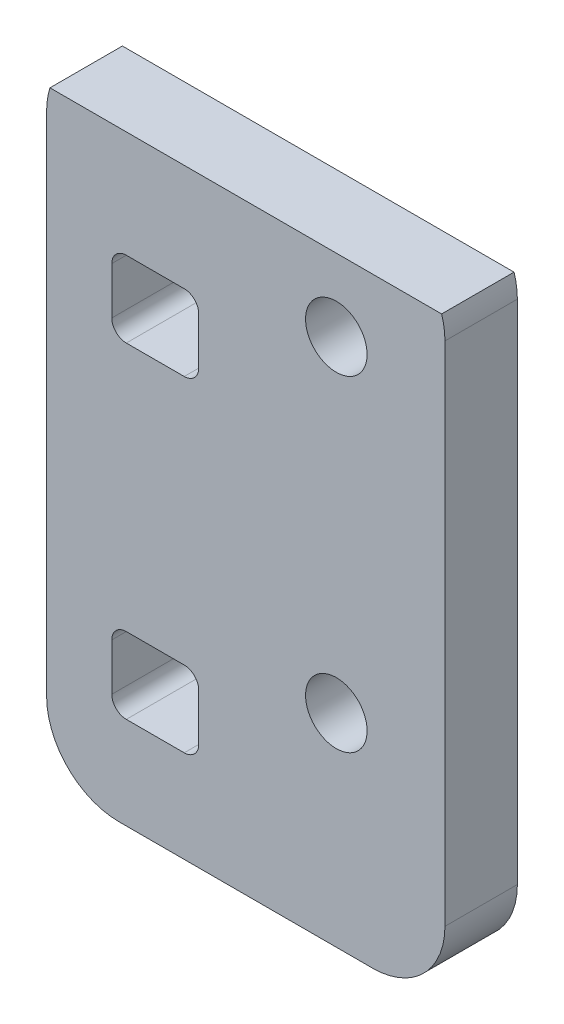
ISO-10303-21;
HEADER;
FILE_DESCRIPTION(('STEP AP214'),'2;1');
FILE_NAME('part.step','',(''),(''),'','','');
FILE_SCHEMA(('AUTOMOTIVE_DESIGN { 1 0 10303 214 1 1 1 1 }'));
ENDSEC;
DATA;
#1=APPLICATION_CONTEXT('core data for automotive mechanical design processes');
#2=APPLICATION_PROTOCOL_DEFINITION('international standard','automotive_design',2000,#1);
#3=PRODUCT_CONTEXT('',#1,'mechanical');
#4=PRODUCT('Part','Part','',(#3));
#5=PRODUCT_RELATED_PRODUCT_CATEGORY('part','',(#4));
#6=PRODUCT_DEFINITION_FORMATION('','',#4);
#7=PRODUCT_DEFINITION_CONTEXT('part definition',#1,'design');
#8=PRODUCT_DEFINITION('design','',#6,#7);
#9=PRODUCT_DEFINITION_SHAPE('','',#8);
#10=(LENGTH_UNIT() NAMED_UNIT(*) SI_UNIT(.MILLI.,.METRE.));
#11=(NAMED_UNIT(*) PLANE_ANGLE_UNIT() SI_UNIT($,.RADIAN.));
#12=(NAMED_UNIT(*) SI_UNIT($,.STERADIAN.) SOLID_ANGLE_UNIT());
#13=UNCERTAINTY_MEASURE_WITH_UNIT(LENGTH_MEASURE(1.E-05),#10,'distance_accuracy_value','');
#14=(GEOMETRIC_REPRESENTATION_CONTEXT(3) GLOBAL_UNCERTAINTY_ASSIGNED_CONTEXT((#13)) GLOBAL_UNIT_ASSIGNED_CONTEXT((#10,
#11,#12)) REPRESENTATION_CONTEXT('',''));
#15=CARTESIAN_POINT('',(0.,0.,0.));
#16=DIRECTION('',(0.,0.,1.));
#17=DIRECTION('',(1.,0.,0.));
#18=AXIS2_PLACEMENT_3D('',#15,#16,#17);
#19=CARTESIAN_POINT('',(73.9999999999384,0.,10.));
#20=DIRECTION('',(1.,0.,0.));
#21=DIRECTION('',(0.,1.,0.));
#22=AXIS2_PLACEMENT_3D('',#19,#20,#21);
#23=PLANE('',#22);
#24=DIRECTION('',(0.,-1.,0.));
#25=VECTOR('',#24,1.);
#26=CARTESIAN_POINT('',(73.9999999999384,0.,10.));
#27=LINE('',#26,#25);
#28=CARTESIAN_POINT('',(73.9999999999384,300.320623631729,10.));
#29=VERTEX_POINT('',#28);
#30=CARTESIAN_POINT('',(73.9999999999384,230.320623631729,10.));
#31=VERTEX_POINT('',#30);
#32=EDGE_CURVE('E242',#29,#31,#27,.T.);
#33=ORIENTED_EDGE('',*,*,#32,.T.);
#34=DIRECTION('',(0.,0.,-1.));
#35=VECTOR('',#34,1.);
#36=CARTESIAN_POINT('',(73.9999999999384,230.320623631729,10.));
#37=LINE('',#36,#35);
#38=CARTESIAN_POINT('',(73.9999999999384,230.320623631729,0.));
#39=VERTEX_POINT('',#38);
#40=EDGE_CURVE('E325',#31,#39,#37,.T.);
#41=ORIENTED_EDGE('',*,*,#40,.T.);
#42=DIRECTION('',(0.,-1.,0.));
#43=VECTOR('',#42,1.);
#44=CARTESIAN_POINT('',(73.9999999999384,0.,0.));
#45=LINE('',#44,#43);
#46=CARTESIAN_POINT('',(73.9999999999384,300.320623631729,0.));
#47=VERTEX_POINT('',#46);
#48=EDGE_CURVE('E269',#47,#39,#45,.T.);
#49=ORIENTED_EDGE('',*,*,#48,.F.);
#50=DIRECTION('',(0.,0.,-1.));
#51=VECTOR('',#50,1.);
#52=CARTESIAN_POINT('',(73.9999999999384,300.320623631729,10.));
#53=LINE('',#52,#51);
#54=EDGE_CURVE('E305',#47,#29,#53,.F.);
#55=ORIENTED_EDGE('',*,*,#54,.T.);
#56=EDGE_LOOP('',(#33,#41,#49,#55));
#57=FACE_BOUND('',#56,.T.);
#58=ADVANCED_FACE('F39',(#57),#23,.T.);
#59=CARTESIAN_POINT('',(18.9999999999385,0.,10.));
#60=DIRECTION('',(1.,0.,0.));
#61=DIRECTION('',(0.,1.,0.));
#62=AXIS2_PLACEMENT_3D('',#59,#60,#61);
#63=PLANE('',#62);
#64=DIRECTION('',(0.,-1.,0.));
#65=VECTOR('',#64,1.);
#66=CARTESIAN_POINT('',(18.9999999999385,0.,0.));
#67=LINE('',#66,#65);
#68=CARTESIAN_POINT('',(18.9999999999384,300.320623631729,0.));
#69=VERTEX_POINT('',#68);
#70=CARTESIAN_POINT('',(18.9999999999384,230.320623631729,0.));
#71=VERTEX_POINT('',#70);
#72=EDGE_CURVE('E261',#69,#71,#67,.T.);
#73=ORIENTED_EDGE('',*,*,#72,.T.);
#74=DIRECTION('',(0.,0.,-1.));
#75=VECTOR('',#74,1.);
#76=CARTESIAN_POINT('',(18.9999999999384,230.320623631729,10.));
#77=LINE('',#76,#75);
#78=CARTESIAN_POINT('',(18.9999999999384,230.320623631729,10.));
#79=VERTEX_POINT('',#78);
#80=EDGE_CURVE('E47',#71,#79,#77,.F.);
#81=ORIENTED_EDGE('',*,*,#80,.T.);
#82=DIRECTION('',(0.,-1.,0.));
#83=VECTOR('',#82,1.);
#84=CARTESIAN_POINT('',(18.9999999999385,0.,10.));
#85=LINE('',#84,#83);
#86=CARTESIAN_POINT('',(18.9999999999384,300.320623631729,10.));
#87=VERTEX_POINT('',#86);
#88=EDGE_CURVE('E237',#87,#79,#85,.T.);
#89=ORIENTED_EDGE('',*,*,#88,.F.);
#90=DIRECTION('',(0.,0.,-1.));
#91=VECTOR('',#90,1.);
#92=CARTESIAN_POINT('',(18.9999999999384,300.320623631729,10.));
#93=LINE('',#92,#91);
#94=EDGE_CURVE('E217',#87,#69,#93,.T.);
#95=ORIENTED_EDGE('',*,*,#94,.T.);
#96=EDGE_LOOP('',(#73,#81,#89,#95));
#97=FACE_BOUND('',#96,.T.);
#98=ADVANCED_FACE('F260',(#97),#63,.F.);
#99=CARTESIAN_POINT('',(27.9999999999533,0.,10.));
#100=DIRECTION('',(-1.,0.,0.));
#101=DIRECTION('',(0.,0.,1.));
#102=AXIS2_PLACEMENT_3D('',#99,#100,#101);
#103=PLANE('',#102);
#104=DIRECTION('',(0.,1.,0.));
#105=VECTOR('',#104,1.);
#106=CARTESIAN_POINT('',(27.9999999999533,0.,0.));
#107=LINE('',#106,#105);
#108=CARTESIAN_POINT('',(27.9999999999533,280.070623631712,0.));
#109=VERTEX_POINT('',#108);
#110=CARTESIAN_POINT('',(27.9999999999533,286.570623631712,0.));
#111=VERTEX_POINT('',#110);
#112=EDGE_CURVE('E736',#109,#111,#107,.T.);
#113=ORIENTED_EDGE('',*,*,#112,.T.);
#114=DIRECTION('',(0.,0.,-1.));
#115=VECTOR('',#114,1.);
#116=CARTESIAN_POINT('',(27.9999999999533,286.570623631712,10.));
#117=LINE('',#116,#115);
#118=CARTESIAN_POINT('',(27.9999999999533,286.570623631712,10.));
#119=VERTEX_POINT('',#118);
#120=EDGE_CURVE('E302',#119,#111,#117,.T.);
#121=ORIENTED_EDGE('',*,*,#120,.F.);
#122=DIRECTION('',(0.,1.,0.));
#123=VECTOR('',#122,1.);
#124=CARTESIAN_POINT('',(27.9999999999533,0.,10.));
#125=LINE('',#124,#123);
#126=CARTESIAN_POINT('',(27.9999999999533,280.070623631712,10.));
#127=VERTEX_POINT('',#126);
#128=EDGE_CURVE('E387',#127,#119,#125,.T.);
#129=ORIENTED_EDGE('',*,*,#128,.F.);
#130=DIRECTION('',(0.,0.,-1.));
#131=VECTOR('',#130,1.);
#132=CARTESIAN_POINT('',(27.9999999999533,280.070623631712,10.));
#133=LINE('',#132,#131);
#134=EDGE_CURVE('E284',#127,#109,#133,.T.);
#135=ORIENTED_EDGE('',*,*,#134,.T.);
#136=EDGE_LOOP('',(#113,#121,#129,#135));
#137=FACE_BOUND('',#136,.T.);
#138=ADVANCED_FACE('F447',(#137),#103,.F.);
#139=CARTESIAN_POINT('',(29.9999999999533,286.570623631712,10.));
#140=DIRECTION('',(0.,0.,-1.));
#141=DIRECTION('',(-1.,0.,0.));
#142=AXIS2_PLACEMENT_3D('',#139,#140,#141);
#143=CYLINDRICAL_SURFACE('',#142,2.);
#144=CARTESIAN_POINT('',(29.9999999999533,286.570623631712,0.));
#145=DIRECTION('',(0.,0.,1.));
#146=DIRECTION('',(1.,0.,0.));
#147=AXIS2_PLACEMENT_3D('',#144,#145,#146);
#148=CIRCLE('',#147,2.);
#149=CARTESIAN_POINT('',(29.9999999999533,288.570623631712,0.));
#150=VERTEX_POINT('',#149);
#151=EDGE_CURVE('E739',#111,#150,#148,.F.);
#152=ORIENTED_EDGE('',*,*,#151,.T.);
#153=DIRECTION('',(0.,0.,-1.));
#154=VECTOR('',#153,1.);
#155=CARTESIAN_POINT('',(29.9999999999533,288.570623631712,10.));
#156=LINE('',#155,#154);
#157=CARTESIAN_POINT('',(29.9999999999533,288.570623631712,10.));
#158=VERTEX_POINT('',#157);
#159=EDGE_CURVE('E299',#158,#150,#156,.T.);
#160=ORIENTED_EDGE('',*,*,#159,.F.);
#161=CARTESIAN_POINT('',(29.9999999999533,286.570623631712,10.));
#162=DIRECTION('',(0.,0.,1.));
#163=DIRECTION('',(1.,0.,0.));
#164=AXIS2_PLACEMENT_3D('',#161,#162,#163);
#165=CIRCLE('',#164,2.);
#166=EDGE_CURVE('E384',#119,#158,#165,.F.);
#167=ORIENTED_EDGE('',*,*,#166,.F.);
#168=ORIENTED_EDGE('',*,*,#120,.T.);
#169=EDGE_LOOP('',(#152,#160,#167,#168));
#170=FACE_BOUND('',#169,.T.);
#171=ADVANCED_FACE('F476',(#170),#143,.F.);
#172=CARTESIAN_POINT('',(0.,288.570623631712,10.));
#173=DIRECTION('',(0.,1.,0.));
#174=DIRECTION('',(0.,0.,1.));
#175=AXIS2_PLACEMENT_3D('',#172,#173,#174);
#176=PLANE('',#175);
#177=DIRECTION('',(1.,0.,0.));
#178=VECTOR('',#177,1.);
#179=CARTESIAN_POINT('',(0.,288.570623631712,0.));
#180=LINE('',#179,#178);
#181=CARTESIAN_POINT('',(37.9999999999533,288.570623631712,0.));
#182=VERTEX_POINT('',#181);
#183=EDGE_CURVE('E741',#150,#182,#180,.T.);
#184=ORIENTED_EDGE('',*,*,#183,.T.);
#185=DIRECTION('',(0.,0.,-1.));
#186=VECTOR('',#185,1.);
#187=CARTESIAN_POINT('',(37.9999999999533,288.570623631712,10.));
#188=LINE('',#187,#186);
#189=CARTESIAN_POINT('',(37.9999999999533,288.570623631712,10.));
#190=VERTEX_POINT('',#189);
#191=EDGE_CURVE('E296',#190,#182,#188,.T.);
#192=ORIENTED_EDGE('',*,*,#191,.F.);
#193=DIRECTION('',(1.,0.,0.));
#194=VECTOR('',#193,1.);
#195=CARTESIAN_POINT('',(0.,288.570623631712,10.));
#196=LINE('',#195,#194);
#197=EDGE_CURVE('E380',#158,#190,#196,.T.);
#198=ORIENTED_EDGE('',*,*,#197,.F.);
#199=ORIENTED_EDGE('',*,*,#159,.T.);
#200=EDGE_LOOP('',(#184,#192,#198,#199));
#201=FACE_BOUND('',#200,.T.);
#202=ADVANCED_FACE('F472',(#201),#176,.F.);
#203=CARTESIAN_POINT('',(37.9999999999533,286.570623631712,10.));
#204=DIRECTION('',(0.,0.,-1.));
#205=DIRECTION('',(-1.,0.,0.));
#206=AXIS2_PLACEMENT_3D('',#203,#204,#205);
#207=CYLINDRICAL_SURFACE('',#206,2.);
#208=CARTESIAN_POINT('',(37.9999999999533,286.570623631712,0.));
#209=DIRECTION('',(0.,0.,1.));
#210=DIRECTION('',(1.,0.,0.));
#211=AXIS2_PLACEMENT_3D('',#208,#209,#210);
#212=CIRCLE('',#211,2.);
#213=CARTESIAN_POINT('',(39.9999999999533,286.570623631712,0.));
#214=VERTEX_POINT('',#213);
#215=EDGE_CURVE('E743',#182,#214,#212,.F.);
#216=ORIENTED_EDGE('',*,*,#215,.T.);
#217=DIRECTION('',(0.,0.,-1.));
#218=VECTOR('',#217,1.);
#219=CARTESIAN_POINT('',(39.9999999999533,286.570623631712,10.));
#220=LINE('',#219,#218);
#221=CARTESIAN_POINT('',(39.9999999999533,286.570623631712,10.));
#222=VERTEX_POINT('',#221);
#223=EDGE_CURVE('E294',#222,#214,#220,.T.);
#224=ORIENTED_EDGE('',*,*,#223,.F.);
#225=CARTESIAN_POINT('',(37.9999999999533,286.570623631712,10.));
#226=DIRECTION('',(0.,0.,1.));
#227=DIRECTION('',(1.,0.,0.));
#228=AXIS2_PLACEMENT_3D('',#225,#226,#227);
#229=CIRCLE('',#228,2.);
#230=EDGE_CURVE('E378',#190,#222,#229,.F.);
#231=ORIENTED_EDGE('',*,*,#230,.F.);
#232=ORIENTED_EDGE('',*,*,#191,.T.);
#233=EDGE_LOOP('',(#216,#224,#231,#232));
#234=FACE_BOUND('',#233,.T.);
#235=ADVANCED_FACE('F468',(#234),#207,.F.);
#236=CARTESIAN_POINT('',(39.9999999999533,0.,10.));
#237=DIRECTION('',(-1.,0.,0.));
#238=DIRECTION('',(0.,0.,1.));
#239=AXIS2_PLACEMENT_3D('',#236,#237,#238);
#240=PLANE('',#239);
#241=DIRECTION('',(0.,1.,0.));
#242=VECTOR('',#241,1.);
#243=CARTESIAN_POINT('',(39.9999999999533,0.,0.));
#244=LINE('',#243,#242);
#245=CARTESIAN_POINT('',(39.9999999999533,280.070623631712,0.));
#246=VERTEX_POINT('',#245);
#247=EDGE_CURVE('E746',#246,#214,#244,.T.);
#248=ORIENTED_EDGE('',*,*,#247,.F.);
#249=DIRECTION('',(0.,0.,-1.));
#250=VECTOR('',#249,1.);
#251=CARTESIAN_POINT('',(39.9999999999533,280.070623631712,10.));
#252=LINE('',#251,#250);
#253=CARTESIAN_POINT('',(39.9999999999533,280.070623631712,10.));
#254=VERTEX_POINT('',#253);
#255=EDGE_CURVE('E292',#254,#246,#252,.T.);
#256=ORIENTED_EDGE('',*,*,#255,.F.);
#257=DIRECTION('',(0.,1.,0.));
#258=VECTOR('',#257,1.);
#259=CARTESIAN_POINT('',(39.9999999999533,0.,10.));
#260=LINE('',#259,#258);
#261=EDGE_CURVE('E373',#254,#222,#260,.T.);
#262=ORIENTED_EDGE('',*,*,#261,.T.);
#263=ORIENTED_EDGE('',*,*,#223,.T.);
#264=EDGE_LOOP('',(#248,#256,#262,#263));
#265=FACE_BOUND('',#264,.T.);
#266=ADVANCED_FACE('F464',(#265),#240,.T.);
#267=CARTESIAN_POINT('',(37.9999999999533,280.070623631712,10.));
#268=DIRECTION('',(0.,0.,-1.));
#269=DIRECTION('',(-1.,0.,0.));
#270=AXIS2_PLACEMENT_3D('',#267,#268,#269);
#271=CYLINDRICAL_SURFACE('',#270,2.);
#272=CARTESIAN_POINT('',(37.9999999999533,280.070623631712,0.));
#273=DIRECTION('',(0.,0.,1.));
#274=DIRECTION('',(1.,0.,0.));
#275=AXIS2_PLACEMENT_3D('',#272,#273,#274);
#276=CIRCLE('',#275,2.);
#277=CARTESIAN_POINT('',(37.9999999999533,278.070623631712,0.));
#278=VERTEX_POINT('',#277);
#279=EDGE_CURVE('E749',#278,#246,#276,.T.);
#280=ORIENTED_EDGE('',*,*,#279,.F.);
#281=DIRECTION('',(0.,0.,-1.));
#282=VECTOR('',#281,1.);
#283=CARTESIAN_POINT('',(37.9999999999533,278.070623631712,10.));
#284=LINE('',#283,#282);
#285=CARTESIAN_POINT('',(37.9999999999533,278.070623631712,10.));
#286=VERTEX_POINT('',#285);
#287=EDGE_CURVE('E290',#286,#278,#284,.T.);
#288=ORIENTED_EDGE('',*,*,#287,.F.);
#289=CARTESIAN_POINT('',(37.9999999999533,280.070623631712,10.));
#290=DIRECTION('',(0.,0.,1.));
#291=DIRECTION('',(1.,0.,0.));
#292=AXIS2_PLACEMENT_3D('',#289,#290,#291);
#293=CIRCLE('',#292,2.);
#294=EDGE_CURVE('E362',#286,#254,#293,.T.);
#295=ORIENTED_EDGE('',*,*,#294,.T.);
#296=ORIENTED_EDGE('',*,*,#255,.T.);
#297=EDGE_LOOP('',(#280,#288,#295,#296));
#298=FACE_BOUND('',#297,.T.);
#299=ADVANCED_FACE('F460',(#298),#271,.F.);
#300=CARTESIAN_POINT('',(0.,278.070623631712,10.));
#301=DIRECTION('',(0.,1.,0.));
#302=DIRECTION('',(0.,0.,1.));
#303=AXIS2_PLACEMENT_3D('',#300,#301,#302);
#304=PLANE('',#303);
#305=DIRECTION('',(1.,0.,0.));
#306=VECTOR('',#305,1.);
#307=CARTESIAN_POINT('',(0.,278.070623631712,0.));
#308=LINE('',#307,#306);
#309=CARTESIAN_POINT('',(29.9999999999533,278.070623631712,0.));
#310=VERTEX_POINT('',#309);
#311=EDGE_CURVE('E752',#310,#278,#308,.T.);
#312=ORIENTED_EDGE('',*,*,#311,.F.);
#313=DIRECTION('',(0.,0.,-1.));
#314=VECTOR('',#313,1.);
#315=CARTESIAN_POINT('',(29.9999999999533,278.070623631712,10.));
#316=LINE('',#315,#314);
#317=CARTESIAN_POINT('',(29.9999999999533,278.070623631712,10.));
#318=VERTEX_POINT('',#317);
#319=EDGE_CURVE('E287',#318,#310,#316,.T.);
#320=ORIENTED_EDGE('',*,*,#319,.F.);
#321=DIRECTION('',(1.,0.,0.));
#322=VECTOR('',#321,1.);
#323=CARTESIAN_POINT('',(0.,278.070623631712,10.));
#324=LINE('',#323,#322);
#325=EDGE_CURVE('E353',#318,#286,#324,.T.);
#326=ORIENTED_EDGE('',*,*,#325,.T.);
#327=ORIENTED_EDGE('',*,*,#287,.T.);
#328=EDGE_LOOP('',(#312,#320,#326,#327));
#329=FACE_BOUND('',#328,.T.);
#330=ADVANCED_FACE('F456',(#329),#304,.T.);
#331=CARTESIAN_POINT('',(29.9999999999533,235.070623631712,10.));
#332=DIRECTION('',(0.,0.,-1.));
#333=DIRECTION('',(-1.,0.,0.));
#334=AXIS2_PLACEMENT_3D('',#331,#332,#333);
#335=CYLINDRICAL_SURFACE('',#334,2.);
#336=CARTESIAN_POINT('',(29.9999999999533,235.070623631712,0.));
#337=DIRECTION('',(0.,0.,1.));
#338=DIRECTION('',(1.,0.,0.));
#339=AXIS2_PLACEMENT_3D('',#336,#337,#338);
#340=CIRCLE('',#339,2.);
#341=CARTESIAN_POINT('',(27.9999999999533,235.070623631712,0.));
#342=VERTEX_POINT('',#341);
#343=CARTESIAN_POINT('',(29.9999999999533,233.070623631712,0.));
#344=VERTEX_POINT('',#343);
#345=EDGE_CURVE('E429',#342,#344,#340,.T.);
#346=ORIENTED_EDGE('',*,*,#345,.F.);
#347=DIRECTION('',(0.,0.,-1.));
#348=VECTOR('',#347,1.);
#349=CARTESIAN_POINT('',(27.9999999999533,235.070623631712,10.));
#350=LINE('',#349,#348);
#351=CARTESIAN_POINT('',(27.9999999999533,235.070623631712,10.));
#352=VERTEX_POINT('',#351);
#353=EDGE_CURVE('E288',#352,#342,#350,.T.);
#354=ORIENTED_EDGE('',*,*,#353,.F.);
#355=CARTESIAN_POINT('',(29.9999999999533,235.070623631712,10.));
#356=DIRECTION('',(0.,0.,1.));
#357=DIRECTION('',(1.,0.,0.));
#358=AXIS2_PLACEMENT_3D('',#355,#356,#357);
#359=CIRCLE('',#358,2.);
#360=CARTESIAN_POINT('',(29.9999999999533,233.070623631712,10.));
#361=VERTEX_POINT('',#360);
#362=EDGE_CURVE('E283',#352,#361,#359,.T.);
#363=ORIENTED_EDGE('',*,*,#362,.T.);
#364=DIRECTION('',(0.,0.,-1.));
#365=VECTOR('',#364,1.);
#366=CARTESIAN_POINT('',(29.9999999999533,233.070623631712,10.));
#367=LINE('',#366,#365);
#368=EDGE_CURVE('E306',#361,#344,#367,.T.);
#369=ORIENTED_EDGE('',*,*,#368,.T.);
#370=EDGE_LOOP('',(#346,#354,#363,#369));
#371=FACE_BOUND('',#370,.T.);
#372=ADVANCED_FACE('F459',(#371),#335,.F.);
#373=CARTESIAN_POINT('',(27.9999999999533,0.,10.));
#374=DIRECTION('',(1.,0.,0.));
#375=DIRECTION('',(0.,0.,-1.));
#376=AXIS2_PLACEMENT_3D('',#373,#374,#375);
#377=PLANE('',#376);
#378=DIRECTION('',(0.,-1.,0.));
#379=VECTOR('',#378,1.);
#380=CARTESIAN_POINT('',(27.9999999999533,0.,0.));
#381=LINE('',#380,#379);
#382=CARTESIAN_POINT('',(27.9999999999533,241.570623631712,0.));
#383=VERTEX_POINT('',#382);
#384=EDGE_CURVE('E717',#383,#342,#381,.T.);
#385=ORIENTED_EDGE('',*,*,#384,.F.);
#386=DIRECTION('',(0.,0.,-1.));
#387=VECTOR('',#386,1.);
#388=CARTESIAN_POINT('',(27.9999999999533,241.570623631712,10.));
#389=LINE('',#388,#387);
#390=CARTESIAN_POINT('',(27.9999999999533,241.570623631712,10.));
#391=VERTEX_POINT('',#390);
#392=EDGE_CURVE('E321',#391,#383,#389,.T.);
#393=ORIENTED_EDGE('',*,*,#392,.F.);
#394=DIRECTION('',(0.,-1.,0.));
#395=VECTOR('',#394,1.);
#396=CARTESIAN_POINT('',(27.9999999999533,0.,10.));
#397=LINE('',#396,#395);
#398=EDGE_CURVE('E421',#391,#352,#397,.T.);
#399=ORIENTED_EDGE('',*,*,#398,.T.);
#400=ORIENTED_EDGE('',*,*,#353,.T.);
#401=EDGE_LOOP('',(#385,#393,#399,#400));
#402=FACE_BOUND('',#401,.T.);
#403=ADVANCED_FACE('F508',(#402),#377,.T.);
#404=CARTESIAN_POINT('',(29.9999999999533,241.570623631712,10.));
#405=DIRECTION('',(0.,0.,-1.));
#406=DIRECTION('',(-1.,0.,0.));
#407=AXIS2_PLACEMENT_3D('',#404,#405,#406);
#408=CYLINDRICAL_SURFACE('',#407,2.);
#409=CARTESIAN_POINT('',(29.9999999999533,241.570623631712,0.));
#410=DIRECTION('',(0.,0.,1.));
#411=DIRECTION('',(1.,0.,0.));
#412=AXIS2_PLACEMENT_3D('',#409,#410,#411);
#413=CIRCLE('',#412,2.);
#414=CARTESIAN_POINT('',(29.9999999999533,243.570623631712,0.));
#415=VERTEX_POINT('',#414);
#416=EDGE_CURVE('E720',#415,#383,#413,.T.);
#417=ORIENTED_EDGE('',*,*,#416,.F.);
#418=DIRECTION('',(0.,0.,-1.));
#419=VECTOR('',#418,1.);
#420=CARTESIAN_POINT('',(29.9999999999533,243.570623631712,10.));
#421=LINE('',#420,#419);
#422=CARTESIAN_POINT('',(29.9999999999533,243.570623631712,10.));
#423=VERTEX_POINT('',#422);
#424=EDGE_CURVE('E319',#423,#415,#421,.T.);
#425=ORIENTED_EDGE('',*,*,#424,.F.);
#426=CARTESIAN_POINT('',(29.9999999999533,241.570623631712,10.));
#427=DIRECTION('',(0.,0.,1.));
#428=DIRECTION('',(1.,0.,0.));
#429=AXIS2_PLACEMENT_3D('',#426,#427,#428);
#430=CIRCLE('',#429,2.);
#431=EDGE_CURVE('E414',#423,#391,#430,.T.);
#432=ORIENTED_EDGE('',*,*,#431,.T.);
#433=ORIENTED_EDGE('',*,*,#392,.T.);
#434=EDGE_LOOP('',(#417,#425,#432,#433));
#435=FACE_BOUND('',#434,.T.);
#436=ADVANCED_FACE('F504',(#435),#408,.F.);
#437=CARTESIAN_POINT('',(0.,243.570623631712,10.));
#438=DIRECTION('',(0.,1.,0.));
#439=DIRECTION('',(0.,0.,1.));
#440=AXIS2_PLACEMENT_3D('',#437,#438,#439);
#441=PLANE('',#440);
#442=DIRECTION('',(1.,0.,0.));
#443=VECTOR('',#442,1.);
#444=CARTESIAN_POINT('',(0.,243.570623631712,0.));
#445=LINE('',#444,#443);
#446=CARTESIAN_POINT('',(37.9999999999533,243.570623631712,0.));
#447=VERTEX_POINT('',#446);
#448=EDGE_CURVE('E723',#415,#447,#445,.T.);
#449=ORIENTED_EDGE('',*,*,#448,.T.);
#450=DIRECTION('',(0.,0.,-1.));
#451=VECTOR('',#450,1.);
#452=CARTESIAN_POINT('',(37.9999999999533,243.570623631712,10.));
#453=LINE('',#452,#451);
#454=CARTESIAN_POINT('',(37.9999999999533,243.570623631712,10.));
#455=VERTEX_POINT('',#454);
#456=EDGE_CURVE('E316',#455,#447,#453,.T.);
#457=ORIENTED_EDGE('',*,*,#456,.F.);
#458=DIRECTION('',(1.,0.,0.));
#459=VECTOR('',#458,1.);
#460=CARTESIAN_POINT('',(0.,243.570623631712,10.));
#461=LINE('',#460,#459);
#462=EDGE_CURVE('E410',#423,#455,#461,.T.);
#463=ORIENTED_EDGE('',*,*,#462,.F.);
#464=ORIENTED_EDGE('',*,*,#424,.T.);
#465=EDGE_LOOP('',(#449,#457,#463,#464));
#466=FACE_BOUND('',#465,.T.);
#467=ADVANCED_FACE('F500',(#466),#441,.F.);
#468=CARTESIAN_POINT('',(37.9999999999533,241.570623631712,10.));
#469=DIRECTION('',(0.,0.,-1.));
#470=DIRECTION('',(-1.,0.,0.));
#471=AXIS2_PLACEMENT_3D('',#468,#469,#470);
#472=CYLINDRICAL_SURFACE('',#471,2.);
#473=CARTESIAN_POINT('',(37.9999999999533,241.570623631712,0.));
#474=DIRECTION('',(0.,0.,1.));
#475=DIRECTION('',(1.,0.,0.));
#476=AXIS2_PLACEMENT_3D('',#473,#474,#475);
#477=CIRCLE('',#476,2.);
#478=CARTESIAN_POINT('',(39.9999999999533,241.570623631712,0.));
#479=VERTEX_POINT('',#478);
#480=EDGE_CURVE('E725',#447,#479,#477,.F.);
#481=ORIENTED_EDGE('',*,*,#480,.T.);
#482=DIRECTION('',(0.,0.,-1.));
#483=VECTOR('',#482,1.);
#484=CARTESIAN_POINT('',(39.9999999999533,241.570623631712,10.));
#485=LINE('',#484,#483);
#486=CARTESIAN_POINT('',(39.9999999999533,241.570623631712,10.));
#487=VERTEX_POINT('',#486);
#488=EDGE_CURVE('E313',#487,#479,#485,.T.);
#489=ORIENTED_EDGE('',*,*,#488,.F.);
#490=CARTESIAN_POINT('',(37.9999999999533,241.570623631712,10.));
#491=DIRECTION('',(0.,0.,1.));
#492=DIRECTION('',(1.,0.,0.));
#493=AXIS2_PLACEMENT_3D('',#490,#491,#492);
#494=CIRCLE('',#493,2.);
#495=EDGE_CURVE('E407',#455,#487,#494,.F.);
#496=ORIENTED_EDGE('',*,*,#495,.F.);
#497=ORIENTED_EDGE('',*,*,#456,.T.);
#498=EDGE_LOOP('',(#481,#489,#496,#497));
#499=FACE_BOUND('',#498,.T.);
#500=ADVANCED_FACE('F496',(#499),#472,.F.);
#501=CARTESIAN_POINT('',(39.9999999999533,0.,10.));
#502=DIRECTION('',(1.,0.,0.));
#503=DIRECTION('',(0.,0.,-1.));
#504=AXIS2_PLACEMENT_3D('',#501,#502,#503);
#505=PLANE('',#504);
#506=DIRECTION('',(0.,-1.,0.));
#507=VECTOR('',#506,1.);
#508=CARTESIAN_POINT('',(39.9999999999533,0.,0.));
#509=LINE('',#508,#507);
#510=CARTESIAN_POINT('',(39.9999999999533,235.070623631712,0.));
#511=VERTEX_POINT('',#510);
#512=EDGE_CURVE('E727',#479,#511,#509,.T.);
#513=ORIENTED_EDGE('',*,*,#512,.T.);
#514=DIRECTION('',(0.,0.,-1.));
#515=VECTOR('',#514,1.);
#516=CARTESIAN_POINT('',(39.9999999999533,235.070623631712,10.));
#517=LINE('',#516,#515);
#518=CARTESIAN_POINT('',(39.9999999999533,235.070623631712,10.));
#519=VERTEX_POINT('',#518);
#520=EDGE_CURVE('E311',#519,#511,#517,.T.);
#521=ORIENTED_EDGE('',*,*,#520,.F.);
#522=DIRECTION('',(0.,-1.,0.));
#523=VECTOR('',#522,1.);
#524=CARTESIAN_POINT('',(39.9999999999533,0.,10.));
#525=LINE('',#524,#523);
#526=EDGE_CURVE('E403',#487,#519,#525,.T.);
#527=ORIENTED_EDGE('',*,*,#526,.F.);
#528=ORIENTED_EDGE('',*,*,#488,.T.);
#529=EDGE_LOOP('',(#513,#521,#527,#528));
#530=FACE_BOUND('',#529,.T.);
#531=ADVANCED_FACE('F492',(#530),#505,.F.);
#532=CARTESIAN_POINT('',(37.9999999999533,235.070623631712,10.));
#533=DIRECTION('',(0.,0.,-1.));
#534=DIRECTION('',(-1.,0.,0.));
#535=AXIS2_PLACEMENT_3D('',#532,#533,#534);
#536=CYLINDRICAL_SURFACE('',#535,2.);
#537=CARTESIAN_POINT('',(37.9999999999533,235.070623631712,0.));
#538=DIRECTION('',(0.,0.,1.));
#539=DIRECTION('',(1.,0.,0.));
#540=AXIS2_PLACEMENT_3D('',#537,#538,#539);
#541=CIRCLE('',#540,2.);
#542=CARTESIAN_POINT('',(37.9999999999533,233.070623631712,0.));
#543=VERTEX_POINT('',#542);
#544=EDGE_CURVE('E730',#543,#511,#541,.T.);
#545=ORIENTED_EDGE('',*,*,#544,.F.);
#546=DIRECTION('',(0.,0.,-1.));
#547=VECTOR('',#546,1.);
#548=CARTESIAN_POINT('',(37.9999999999533,233.070623631712,10.));
#549=LINE('',#548,#547);
#550=CARTESIAN_POINT('',(37.9999999999533,233.070623631712,10.));
#551=VERTEX_POINT('',#550);
#552=EDGE_CURVE('E308',#551,#543,#549,.T.);
#553=ORIENTED_EDGE('',*,*,#552,.F.);
#554=CARTESIAN_POINT('',(37.9999999999533,235.070623631712,10.));
#555=DIRECTION('',(0.,0.,1.));
#556=DIRECTION('',(1.,0.,0.));
#557=AXIS2_PLACEMENT_3D('',#554,#555,#556);
#558=CIRCLE('',#557,2.);
#559=EDGE_CURVE('E399',#551,#519,#558,.T.);
#560=ORIENTED_EDGE('',*,*,#559,.T.);
#561=ORIENTED_EDGE('',*,*,#520,.T.);
#562=EDGE_LOOP('',(#545,#553,#560,#561));
#563=FACE_BOUND('',#562,.T.);
#564=ADVANCED_FACE('F488',(#563),#536,.F.);
#565=CARTESIAN_POINT('',(58.9999999999384,248.320623631729,10.));
#566=DIRECTION('',(0.,0.,-1.));
#567=DIRECTION('',(-1.,0.,0.));
#568=AXIS2_PLACEMENT_3D('',#565,#566,#567);
#569=CYLINDRICAL_SURFACE('',#568,4.25000000000001);
#570=CARTESIAN_POINT('',(58.9999999999384,248.320623631729,10.));
#571=DIRECTION('',(0.,0.,1.));
#572=DIRECTION('',(1.,0.,0.));
#573=AXIS2_PLACEMENT_3D('',#570,#571,#572);
#574=CIRCLE('',#573,4.25000000000001);
#575=CARTESIAN_POINT('',(63.2499999999384,248.320623631729,10.));
#576=VERTEX_POINT('',#575);
#577=EDGE_CURVE('E249',#576,#576,#574,.F.);
#578=ORIENTED_EDGE('',*,*,#577,.F.);
#579=EDGE_LOOP('',(#578));
#580=FACE_BOUND('',#579,.T.);
#581=CARTESIAN_POINT('',(58.9999999999384,248.320623631729,0.));
#582=DIRECTION('',(0.,0.,1.));
#583=DIRECTION('',(1.,0.,0.));
#584=AXIS2_PLACEMENT_3D('',#581,#582,#583);
#585=CIRCLE('',#584,4.25000000000001);
#586=CARTESIAN_POINT('',(63.2499999999384,248.320623631729,0.));
#587=VERTEX_POINT('',#586);
#588=EDGE_CURVE('E271',#587,#587,#585,.F.);
#589=ORIENTED_EDGE('',*,*,#588,.T.);
#590=EDGE_LOOP('',(#589));
#591=FACE_BOUND('',#590,.T.);
#592=ADVANCED_FACE('F491',(#580,#591),#569,.F.);
#593=CARTESIAN_POINT('',(0.,220.320623631729,10.));
#594=DIRECTION('',(0.,-1.,0.));
#595=DIRECTION('',(0.,0.,-1.));
#596=AXIS2_PLACEMENT_3D('',#593,#594,#595);
#597=PLANE('',#596);
#598=DIRECTION('',(-1.,0.,0.));
#599=VECTOR('',#598,1.);
#600=CARTESIAN_POINT('',(0.,220.320623631729,0.));
#601=LINE('',#600,#599);
#602=CARTESIAN_POINT('',(63.9999999999384,220.320623631729,0.));
#603=VERTEX_POINT('',#602);
#604=CARTESIAN_POINT('',(28.9999999999384,220.320623631729,0.));
#605=VERTEX_POINT('',#604);
#606=EDGE_CURVE('E268',#603,#605,#601,.T.);
#607=ORIENTED_EDGE('',*,*,#606,.F.);
#608=DIRECTION('',(0.,0.,-1.));
#609=VECTOR('',#608,1.);
#610=CARTESIAN_POINT('',(63.9999999999384,220.320623631729,10.));
#611=LINE('',#610,#609);
#612=CARTESIAN_POINT('',(63.9999999999384,220.320623631729,10.));
#613=VERTEX_POINT('',#612);
#614=EDGE_CURVE('E219',#603,#613,#611,.F.);
#615=ORIENTED_EDGE('',*,*,#614,.T.);
#616=DIRECTION('',(-1.,0.,0.));
#617=VECTOR('',#616,1.);
#618=CARTESIAN_POINT('',(0.,220.320623631729,10.));
#619=LINE('',#618,#617);
#620=CARTESIAN_POINT('',(28.9999999999384,220.320623631729,10.));
#621=VERTEX_POINT('',#620);
#622=EDGE_CURVE('E241',#613,#621,#619,.T.);
#623=ORIENTED_EDGE('',*,*,#622,.T.);
#624=DIRECTION('',(0.,0.,-1.));
#625=VECTOR('',#624,1.);
#626=CARTESIAN_POINT('',(28.9999999999384,220.320623631729,0.));
#627=LINE('',#626,#625);
#628=EDGE_CURVE('E225',#621,#605,#627,.T.);
#629=ORIENTED_EDGE('',*,*,#628,.T.);
#630=EDGE_LOOP('',(#607,#615,#623,#629));
#631=FACE_BOUND('',#630,.T.);
#632=ADVANCED_FACE('F337',(#631),#597,.T.);
#633=CARTESIAN_POINT('',(29.9999999999533,280.070623631712,10.));
#634=DIRECTION('',(0.,0.,-1.));
#635=DIRECTION('',(-1.,0.,0.));
#636=AXIS2_PLACEMENT_3D('',#633,#634,#635);
#637=CYLINDRICAL_SURFACE('',#636,2.);
#638=CARTESIAN_POINT('',(29.9999999999533,280.070623631712,0.));
#639=DIRECTION('',(0.,0.,1.));
#640=DIRECTION('',(1.,0.,0.));
#641=AXIS2_PLACEMENT_3D('',#638,#639,#640);
#642=CIRCLE('',#641,2.);
#643=EDGE_CURVE('E274',#310,#109,#642,.F.);
#644=ORIENTED_EDGE('',*,*,#643,.T.);
#645=ORIENTED_EDGE('',*,*,#134,.F.);
#646=CARTESIAN_POINT('',(29.9999999999533,280.070623631712,10.));
#647=DIRECTION('',(0.,0.,1.));
#648=DIRECTION('',(1.,0.,0.));
#649=AXIS2_PLACEMENT_3D('',#646,#647,#648);
#650=CIRCLE('',#649,2.);
#651=EDGE_CURVE('E351',#318,#127,#650,.F.);
#652=ORIENTED_EDGE('',*,*,#651,.F.);
#653=ORIENTED_EDGE('',*,*,#319,.T.);
#654=EDGE_LOOP('',(#644,#645,#652,#653));
#655=FACE_BOUND('',#654,.T.);
#656=ADVANCED_FACE('F451',(#655),#637,.F.);
#657=CARTESIAN_POINT('',(0.,233.070623631712,10.));
#658=DIRECTION('',(0.,1.,0.));
#659=DIRECTION('',(0.,0.,1.));
#660=AXIS2_PLACEMENT_3D('',#657,#658,#659);
#661=PLANE('',#660);
#662=DIRECTION('',(1.,0.,0.));
#663=VECTOR('',#662,1.);
#664=CARTESIAN_POINT('',(0.,233.070623631712,0.));
#665=LINE('',#664,#663);
#666=EDGE_CURVE('E733',#344,#543,#665,.T.);
#667=ORIENTED_EDGE('',*,*,#666,.F.);
#668=ORIENTED_EDGE('',*,*,#368,.F.);
#669=DIRECTION('',(1.,0.,0.));
#670=VECTOR('',#669,1.);
#671=CARTESIAN_POINT('',(0.,233.070623631712,10.));
#672=LINE('',#671,#670);
#673=EDGE_CURVE('E391',#361,#551,#672,.T.);
#674=ORIENTED_EDGE('',*,*,#673,.T.);
#675=ORIENTED_EDGE('',*,*,#552,.T.);
#676=EDGE_LOOP('',(#667,#668,#674,#675));
#677=FACE_BOUND('',#676,.T.);
#678=ADVANCED_FACE('F454',(#677),#661,.T.);
#679=CARTESIAN_POINT('',(58.9999999999384,293.320623631729,10.));
#680=DIRECTION('',(0.,0.,-1.));
#681=DIRECTION('',(-1.,0.,0.));
#682=AXIS2_PLACEMENT_3D('',#679,#680,#681);
#683=CYLINDRICAL_SURFACE('',#682,4.25000000000001);
#684=CARTESIAN_POINT('',(58.9999999999384,293.320623631729,10.));
#685=DIRECTION('',(0.,0.,1.));
#686=DIRECTION('',(1.,0.,0.));
#687=AXIS2_PLACEMENT_3D('',#684,#685,#686);
#688=CIRCLE('',#687,4.25000000000001);
#689=CARTESIAN_POINT('',(63.2499999999384,293.320623631729,10.));
#690=VERTEX_POINT('',#689);
#691=EDGE_CURVE('E309',#690,#690,#688,.T.);
#692=ORIENTED_EDGE('',*,*,#691,.T.);
#693=EDGE_LOOP('',(#692));
#694=FACE_BOUND('',#693,.T.);
#695=CARTESIAN_POINT('',(58.9999999999384,293.320623631729,0.));
#696=DIRECTION('',(0.,0.,1.));
#697=DIRECTION('',(1.,0.,0.));
#698=AXIS2_PLACEMENT_3D('',#695,#696,#697);
#699=CIRCLE('',#698,4.25000000000001);
#700=CARTESIAN_POINT('',(63.2499999999384,293.320623631729,0.));
#701=VERTEX_POINT('',#700);
#702=EDGE_CURVE('E280',#701,#701,#699,.T.);
#703=ORIENTED_EDGE('',*,*,#702,.F.);
#704=EDGE_LOOP('',(#703));
#705=FACE_BOUND('',#704,.T.);
#706=ADVANCED_FACE('F486',(#694,#705),#683,.F.);
#707=CARTESIAN_POINT('',(0.,0.,10.));
#708=DIRECTION('',(0.,0.,1.));
#709=DIRECTION('',(1.,0.,0.));
#710=AXIS2_PLACEMENT_3D('',#707,#708,#709);
#711=PLANE('',#710);
#712=DIRECTION('',(1.,0.,0.));
#713=VECTOR('',#712,1.);
#714=CARTESIAN_POINT('',(1.0636569016977E-12,303.320623631683,10.));
#715=LINE('',#714,#713);
#716=CARTESIAN_POINT('',(19.4606079857545,303.320623631683,10.));
#717=VERTEX_POINT('',#716);
#718=CARTESIAN_POINT('',(73.5393920141223,303.320623631683,10.));
#719=VERTEX_POINT('',#718);
#720=EDGE_CURVE('E199',#717,#719,#715,.T.);
#721=ORIENTED_EDGE('',*,*,#720,.F.);
#722=CARTESIAN_POINT('',(28.9999999999384,300.320623631729,10.));
#723=DIRECTION('',(0.,0.,1.));
#724=DIRECTION('',(1.,0.,0.));
#725=AXIS2_PLACEMENT_3D('',#722,#723,#724);
#726=CIRCLE('',#725,10.);
#727=EDGE_CURVE('E208',#717,#87,#726,.T.);
#728=ORIENTED_EDGE('',*,*,#727,.T.);
#729=ORIENTED_EDGE('',*,*,#88,.T.);
#730=CARTESIAN_POINT('',(28.9999999999384,230.320623631729,10.));
#731=DIRECTION('',(0.,0.,1.));
#732=DIRECTION('',(1.,0.,0.));
#733=AXIS2_PLACEMENT_3D('',#730,#731,#732);
#734=CIRCLE('',#733,10.);
#735=EDGE_CURVE('E223',#79,#621,#734,.T.);
#736=ORIENTED_EDGE('',*,*,#735,.T.);
#737=ORIENTED_EDGE('',*,*,#622,.F.);
#738=CARTESIAN_POINT('',(63.9999999999384,230.320623631729,10.));
#739=DIRECTION('',(0.,0.,1.));
#740=DIRECTION('',(1.,0.,0.));
#741=AXIS2_PLACEMENT_3D('',#738,#739,#740);
#742=CIRCLE('',#741,10.);
#743=EDGE_CURVE('E254',#613,#31,#742,.T.);
#744=ORIENTED_EDGE('',*,*,#743,.T.);
#745=ORIENTED_EDGE('',*,*,#32,.F.);
#746=CARTESIAN_POINT('',(63.9999999999384,300.320623631729,10.));
#747=DIRECTION('',(0.,0.,1.));
#748=DIRECTION('',(1.,0.,0.));
#749=AXIS2_PLACEMENT_3D('',#746,#747,#748);
#750=CIRCLE('',#749,10.);
#751=EDGE_CURVE('E211',#29,#719,#750,.T.);
#752=ORIENTED_EDGE('',*,*,#751,.T.);
#753=EDGE_LOOP('',(#721,#728,#729,#736,#737,#744,#745,#752));
#754=FACE_BOUND('',#753,.T.);
#755=ORIENTED_EDGE('',*,*,#362,.F.);
#756=ORIENTED_EDGE('',*,*,#398,.F.);
#757=ORIENTED_EDGE('',*,*,#431,.F.);
#758=ORIENTED_EDGE('',*,*,#462,.T.);
#759=ORIENTED_EDGE('',*,*,#495,.T.);
#760=ORIENTED_EDGE('',*,*,#526,.T.);
#761=ORIENTED_EDGE('',*,*,#559,.F.);
#762=ORIENTED_EDGE('',*,*,#673,.F.);
#763=EDGE_LOOP('',(#755,#756,#757,#758,#759,#760,#761,#762));
#764=FACE_BOUND('',#763,.T.);
#765=ORIENTED_EDGE('',*,*,#128,.T.);
#766=ORIENTED_EDGE('',*,*,#166,.T.);
#767=ORIENTED_EDGE('',*,*,#197,.T.);
#768=ORIENTED_EDGE('',*,*,#230,.T.);
#769=ORIENTED_EDGE('',*,*,#261,.F.);
#770=ORIENTED_EDGE('',*,*,#294,.F.);
#771=ORIENTED_EDGE('',*,*,#325,.F.);
#772=ORIENTED_EDGE('',*,*,#651,.T.);
#773=EDGE_LOOP('',(#765,#766,#767,#768,#769,#770,#771,#772));
#774=FACE_BOUND('',#773,.T.);
#775=ORIENTED_EDGE('',*,*,#577,.T.);
#776=EDGE_LOOP('',(#775));
#777=FACE_BOUND('',#776,.T.);
#778=ORIENTED_EDGE('',*,*,#691,.F.);
#779=EDGE_LOOP('',(#778));
#780=FACE_BOUND('',#779,.T.);
#781=ADVANCED_FACE('F206',(#754,#764,#774,#777,#780),#711,.T.);
#782=CARTESIAN_POINT('',(0.,0.,0.));
#783=DIRECTION('',(0.,0.,1.));
#784=DIRECTION('',(1.,0.,0.));
#785=AXIS2_PLACEMENT_3D('',#782,#783,#784);
#786=PLANE('',#785);
#787=ORIENTED_EDGE('',*,*,#345,.T.);
#788=ORIENTED_EDGE('',*,*,#666,.T.);
#789=ORIENTED_EDGE('',*,*,#544,.T.);
#790=ORIENTED_EDGE('',*,*,#512,.F.);
#791=ORIENTED_EDGE('',*,*,#480,.F.);
#792=ORIENTED_EDGE('',*,*,#448,.F.);
#793=ORIENTED_EDGE('',*,*,#416,.T.);
#794=ORIENTED_EDGE('',*,*,#384,.T.);
#795=EDGE_LOOP('',(#787,#788,#789,#790,#791,#792,#793,#794));
#796=FACE_BOUND('',#795,.T.);
#797=ORIENTED_EDGE('',*,*,#112,.F.);
#798=ORIENTED_EDGE('',*,*,#643,.F.);
#799=ORIENTED_EDGE('',*,*,#311,.T.);
#800=ORIENTED_EDGE('',*,*,#279,.T.);
#801=ORIENTED_EDGE('',*,*,#247,.T.);
#802=ORIENTED_EDGE('',*,*,#215,.F.);
#803=ORIENTED_EDGE('',*,*,#183,.F.);
#804=ORIENTED_EDGE('',*,*,#151,.F.);
#805=EDGE_LOOP('',(#797,#798,#799,#800,#801,#802,#803,#804));
#806=FACE_BOUND('',#805,.T.);
#807=CARTESIAN_POINT('',(28.9999999999384,300.320623631729,0.));
#808=DIRECTION('',(0.,0.,1.));
#809=DIRECTION('',(1.,0.,0.));
#810=AXIS2_PLACEMENT_3D('',#807,#808,#809);
#811=CIRCLE('',#810,10.);
#812=CARTESIAN_POINT('',(19.4606079857545,303.320623631683,0.));
#813=VERTEX_POINT('',#812);
#814=EDGE_CURVE('E265',#69,#813,#811,.F.);
#815=ORIENTED_EDGE('',*,*,#814,.T.);
#816=DIRECTION('',(1.,0.,0.));
#817=VECTOR('',#816,1.);
#818=CARTESIAN_POINT('',(1.0636569016977E-12,303.320623631683,0.));
#819=LINE('',#818,#817);
#820=CARTESIAN_POINT('',(73.5393920141223,303.320623631683,0.));
#821=VERTEX_POINT('',#820);
#822=EDGE_CURVE('E53',#813,#821,#819,.T.);
#823=ORIENTED_EDGE('',*,*,#822,.T.);
#824=CARTESIAN_POINT('',(63.9999999999384,300.320623631729,0.));
#825=DIRECTION('',(0.,0.,1.));
#826=DIRECTION('',(1.,0.,0.));
#827=AXIS2_PLACEMENT_3D('',#824,#825,#826);
#828=CIRCLE('',#827,10.);
#829=EDGE_CURVE('E329',#821,#47,#828,.F.);
#830=ORIENTED_EDGE('',*,*,#829,.T.);
#831=ORIENTED_EDGE('',*,*,#48,.T.);
#832=CARTESIAN_POINT('',(63.9999999999384,230.320623631729,0.));
#833=DIRECTION('',(0.,0.,1.));
#834=DIRECTION('',(1.,0.,0.));
#835=AXIS2_PLACEMENT_3D('',#832,#833,#834);
#836=CIRCLE('',#835,10.);
#837=EDGE_CURVE('E332',#39,#603,#836,.F.);
#838=ORIENTED_EDGE('',*,*,#837,.T.);
#839=ORIENTED_EDGE('',*,*,#606,.T.);
#840=CARTESIAN_POINT('',(28.9999999999384,230.320623631729,0.));
#841=DIRECTION('',(0.,0.,1.));
#842=DIRECTION('',(1.,0.,0.));
#843=AXIS2_PLACEMENT_3D('',#840,#841,#842);
#844=CIRCLE('',#843,10.);
#845=EDGE_CURVE('E267',#605,#71,#844,.F.);
#846=ORIENTED_EDGE('',*,*,#845,.T.);
#847=ORIENTED_EDGE('',*,*,#72,.F.);
#848=EDGE_LOOP('',(#815,#823,#830,#831,#838,#839,#846,#847));
#849=FACE_BOUND('',#848,.T.);
#850=ORIENTED_EDGE('',*,*,#588,.F.);
#851=EDGE_LOOP('',(#850));
#852=FACE_BOUND('',#851,.T.);
#853=ORIENTED_EDGE('',*,*,#702,.T.);
#854=EDGE_LOOP('',(#853));
#855=FACE_BOUND('',#854,.T.);
#856=ADVANCED_FACE('F263',(#796,#806,#849,#852,#855),#786,.F.);
#857=CARTESIAN_POINT('',(63.9999999999384,230.320623631729,10.));
#858=DIRECTION('',(0.,0.,-1.));
#859=DIRECTION('',(-1.,0.,0.));
#860=AXIS2_PLACEMENT_3D('',#857,#858,#859);
#861=CYLINDRICAL_SURFACE('',#860,10.);
#862=ORIENTED_EDGE('',*,*,#743,.F.);
#863=ORIENTED_EDGE('',*,*,#614,.F.);
#864=ORIENTED_EDGE('',*,*,#837,.F.);
#865=ORIENTED_EDGE('',*,*,#40,.F.);
#866=EDGE_LOOP('',(#862,#863,#864,#865));
#867=FACE_BOUND('',#866,.T.);
#868=ADVANCED_FACE('F346',(#867),#861,.T.);
#869=CARTESIAN_POINT('',(28.9999999999384,230.320623631729,10.));
#870=DIRECTION('',(0.,0.,1.));
#871=DIRECTION('',(1.,0.,0.));
#872=AXIS2_PLACEMENT_3D('',#869,#870,#871);
#873=CYLINDRICAL_SURFACE('',#872,10.);
#874=ORIENTED_EDGE('',*,*,#735,.F.);
#875=ORIENTED_EDGE('',*,*,#80,.F.);
#876=ORIENTED_EDGE('',*,*,#845,.F.);
#877=ORIENTED_EDGE('',*,*,#628,.F.);
#878=EDGE_LOOP('',(#874,#875,#876,#877));
#879=FACE_BOUND('',#878,.T.);
#880=ADVANCED_FACE('F436',(#879),#873,.T.);
#881=CARTESIAN_POINT('',(63.9999999999384,300.320623631729,10.));
#882=DIRECTION('',(0.,0.,1.));
#883=DIRECTION('',(1.,0.,0.));
#884=AXIS2_PLACEMENT_3D('',#881,#882,#883);
#885=CYLINDRICAL_SURFACE('',#884,10.);
#886=DIRECTION('',(0.,0.,1.));
#887=VECTOR('',#886,1.);
#888=CARTESIAN_POINT('',(73.5393920141223,303.320623631683,10.));
#889=LINE('',#888,#887);
#890=EDGE_CURVE('E213',#719,#821,#889,.F.);
#891=ORIENTED_EDGE('',*,*,#890,.F.);
#892=ORIENTED_EDGE('',*,*,#751,.F.);
#893=ORIENTED_EDGE('',*,*,#54,.F.);
#894=ORIENTED_EDGE('',*,*,#829,.F.);
#895=EDGE_LOOP('',(#891,#892,#893,#894));
#896=FACE_BOUND('',#895,.T.);
#897=ADVANCED_FACE('F434',(#896),#885,.T.);
#898=CARTESIAN_POINT('',(28.9999999999384,300.320623631729,10.));
#899=DIRECTION('',(0.,0.,-1.));
#900=DIRECTION('',(-1.,0.,0.));
#901=AXIS2_PLACEMENT_3D('',#898,#899,#900);
#902=CYLINDRICAL_SURFACE('',#901,10.);
#903=DIRECTION('',(0.,0.,-1.));
#904=VECTOR('',#903,1.);
#905=CARTESIAN_POINT('',(19.4606079857545,303.320623631683,10.));
#906=LINE('',#905,#904);
#907=EDGE_CURVE('E12',#813,#717,#906,.F.);
#908=ORIENTED_EDGE('',*,*,#907,.F.);
#909=ORIENTED_EDGE('',*,*,#814,.F.);
#910=ORIENTED_EDGE('',*,*,#94,.F.);
#911=ORIENTED_EDGE('',*,*,#727,.F.);
#912=EDGE_LOOP('',(#908,#909,#910,#911));
#913=FACE_BOUND('',#912,.T.);
#914=ADVANCED_FACE('F41',(#913),#902,.T.);
#915=CARTESIAN_POINT('',(472.999999999933,303.320623631681,10.1000000002192));
#916=DIRECTION('',(0.,-1.,0.));
#917=DIRECTION('',(1.,0.,0.));
#918=AXIS2_PLACEMENT_3D('',#915,#916,#917);
#919=PLANE('',#918);
#920=ORIENTED_EDGE('',*,*,#890,.T.);
#921=ORIENTED_EDGE('',*,*,#822,.F.);
#922=ORIENTED_EDGE('',*,*,#907,.T.);
#923=ORIENTED_EDGE('',*,*,#720,.T.);
#924=EDGE_LOOP('',(#920,#921,#922,#923));
#925=FACE_BOUND('',#924,.T.);
#926=ADVANCED_FACE('F198',(#925),#919,.F.);
#927=CLOSED_SHELL('',(#58,#98,#138,#171,#202,#235,#266,#299,#330,#372,#403,#436,#467,#500,#531,
#564,#592,#632,#656,#678,#706,#781,#856,#868,#880,#897,#914,#926));
#928=MANIFOLD_SOLID_BREP('B2',#927);
#929=ADVANCED_BREP_SHAPE_REPRESENTATION('',(#18,#928),#14);
#930=SHAPE_DEFINITION_REPRESENTATION(#9,#929);
ENDSEC;
END-ISO-10303-21;
